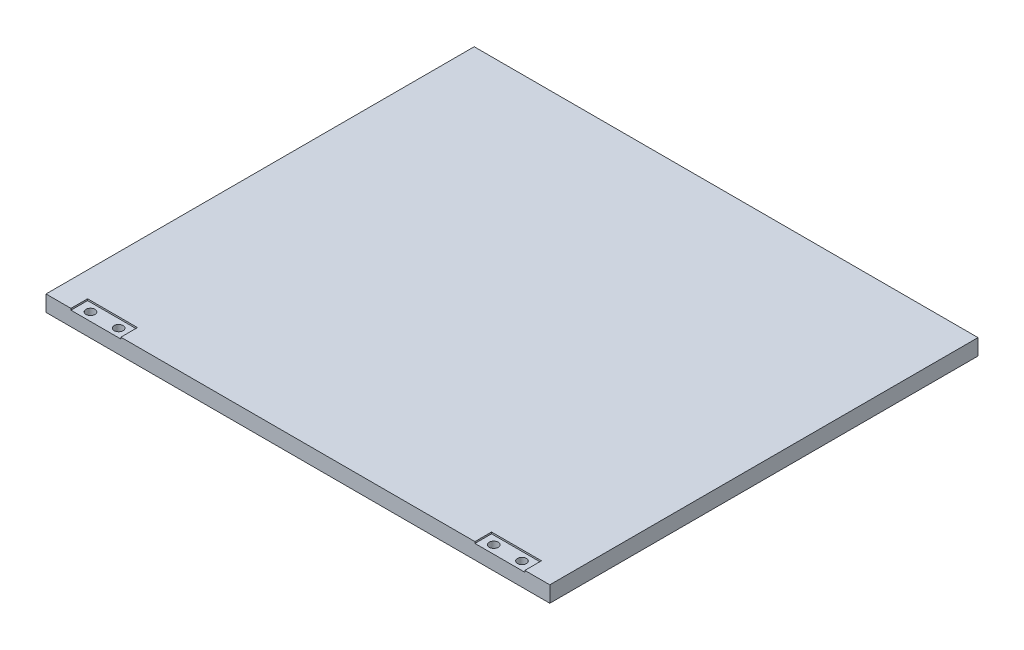
ISO-10303-21;
HEADER;
FILE_DESCRIPTION(('STEP AP214'),'2;1');
FILE_NAME('part.step','',(''),(''),'','','');
FILE_SCHEMA(('AUTOMOTIVE_DESIGN { 1 0 10303 214 1 1 1 1 }'));
ENDSEC;
DATA;
#1=APPLICATION_CONTEXT('core data for automotive mechanical design processes');
#2=APPLICATION_PROTOCOL_DEFINITION('international standard','automotive_design',2000,#1);
#3=PRODUCT_CONTEXT('',#1,'mechanical');
#4=PRODUCT('Part','Part','',(#3));
#5=PRODUCT_RELATED_PRODUCT_CATEGORY('part','',(#4));
#6=PRODUCT_DEFINITION_FORMATION('','',#4);
#7=PRODUCT_DEFINITION_CONTEXT('part definition',#1,'design');
#8=PRODUCT_DEFINITION('design','',#6,#7);
#9=PRODUCT_DEFINITION_SHAPE('','',#8);
#10=(LENGTH_UNIT() NAMED_UNIT(*) SI_UNIT(.MILLI.,.METRE.));
#11=(NAMED_UNIT(*) PLANE_ANGLE_UNIT() SI_UNIT($,.RADIAN.));
#12=(NAMED_UNIT(*) SI_UNIT($,.STERADIAN.) SOLID_ANGLE_UNIT());
#13=UNCERTAINTY_MEASURE_WITH_UNIT(LENGTH_MEASURE(1.E-05),#10,'distance_accuracy_value','');
#14=(GEOMETRIC_REPRESENTATION_CONTEXT(3) GLOBAL_UNCERTAINTY_ASSIGNED_CONTEXT((#13)) GLOBAL_UNIT_ASSIGNED_CONTEXT((#10,
#11,#12)) REPRESENTATION_CONTEXT('',''));
#15=CARTESIAN_POINT('',(0.,0.,0.));
#16=DIRECTION('',(0.,0.,1.));
#17=DIRECTION('',(1.,0.,0.));
#18=AXIS2_PLACEMENT_3D('',#15,#16,#17);
#19=CARTESIAN_POINT('',(0.,0.,0.));
#20=DIRECTION('',(0.,-1.,0.));
#21=DIRECTION('',(0.,0.,-1.));
#22=AXIS2_PLACEMENT_3D('',#19,#20,#21);
#23=PLANE('',#22);
#24=DIRECTION('',(1.,0.,0.));
#25=VECTOR('',#24,1.);
#26=CARTESIAN_POINT('',(71.948,0.,84.223));
#27=LINE('',#26,#25);
#28=CARTESIAN_POINT('',(71.948,0.,84.223));
#29=VERTEX_POINT('',#28);
#30=CARTESIAN_POINT('',(76.998,0.,84.223));
#31=VERTEX_POINT('',#30);
#32=EDGE_CURVE('E302',#29,#31,#27,.T.);
#33=ORIENTED_EDGE('',*,*,#32,.T.);
#34=DIRECTION('',(0.,0.,-1.));
#35=VECTOR('',#34,1.);
#36=CARTESIAN_POINT('',(76.998,0.,79.173));
#37=LINE('',#36,#35);
#38=CARTESIAN_POINT('',(76.998,0.,79.173));
#39=VERTEX_POINT('',#38);
#40=EDGE_CURVE('E68',#31,#39,#37,.T.);
#41=ORIENTED_EDGE('',*,*,#40,.T.);
#42=DIRECTION('',(-1.,0.,0.));
#43=VECTOR('',#42,1.);
#44=CARTESIAN_POINT('',(71.948,0.,79.173));
#45=LINE('',#44,#43);
#46=CARTESIAN_POINT('',(71.948,0.,79.173));
#47=VERTEX_POINT('',#46);
#48=EDGE_CURVE('E290',#39,#47,#45,.T.);
#49=ORIENTED_EDGE('',*,*,#48,.T.);
#50=DIRECTION('',(0.,0.,1.));
#51=VECTOR('',#50,1.);
#52=CARTESIAN_POINT('',(71.948,0.,79.173));
#53=LINE('',#52,#51);
#54=EDGE_CURVE('E306',#47,#29,#53,.T.);
#55=ORIENTED_EDGE('',*,*,#54,.T.);
#56=EDGE_LOOP('',(#33,#41,#49,#55));
#57=FACE_BOUND('',#56,.T.);
#58=DIRECTION('',(0.,0.,1.));
#59=VECTOR('',#58,1.);
#60=CARTESIAN_POINT('',(-83.124,0.,79.173));
#61=LINE('',#60,#59);
#62=CARTESIAN_POINT('',(-83.124,0.,79.173));
#63=VERTEX_POINT('',#62);
#64=CARTESIAN_POINT('',(-83.124,0.,84.223));
#65=VERTEX_POINT('',#64);
#66=EDGE_CURVE('E390',#63,#65,#61,.T.);
#67=ORIENTED_EDGE('',*,*,#66,.F.);
#68=DIRECTION('',(1.,0.,0.));
#69=VECTOR('',#68,1.);
#70=CARTESIAN_POINT('',(-88.174,0.,79.173));
#71=LINE('',#70,#69);
#72=CARTESIAN_POINT('',(-88.174,0.,79.173));
#73=VERTEX_POINT('',#72);
#74=EDGE_CURVE('E377',#73,#63,#71,.T.);
#75=ORIENTED_EDGE('',*,*,#74,.F.);
#76=DIRECTION('',(0.,0.,-1.));
#77=VECTOR('',#76,1.);
#78=CARTESIAN_POINT('',(-88.174,0.,79.173));
#79=LINE('',#78,#77);
#80=CARTESIAN_POINT('',(-88.174,0.,84.223));
#81=VERTEX_POINT('',#80);
#82=EDGE_CURVE('E398',#81,#73,#79,.T.);
#83=ORIENTED_EDGE('',*,*,#82,.F.);
#84=DIRECTION('',(-1.,0.,0.));
#85=VECTOR('',#84,1.);
#86=CARTESIAN_POINT('',(-88.174,0.,84.223));
#87=LINE('',#86,#85);
#88=EDGE_CURVE('E393',#65,#81,#87,.T.);
#89=ORIENTED_EDGE('',*,*,#88,.F.);
#90=EDGE_LOOP('',(#67,#75,#83,#89));
#91=FACE_BOUND('',#90,.T.);
#92=DIRECTION('',(0.,0.,-1.));
#93=VECTOR('',#92,1.);
#94=CARTESIAN_POINT('',(-76.998,0.,79.173));
#95=LINE('',#94,#93);
#96=CARTESIAN_POINT('',(-76.998,0.,84.223));
#97=VERTEX_POINT('',#96);
#98=CARTESIAN_POINT('',(-76.998,0.,79.173));
#99=VERTEX_POINT('',#98);
#100=EDGE_CURVE('E394',#97,#99,#95,.T.);
#101=ORIENTED_EDGE('',*,*,#100,.F.);
#102=DIRECTION('',(-1.,0.,0.));
#103=VECTOR('',#102,1.);
#104=CARTESIAN_POINT('',(-71.948,0.,84.223));
#105=LINE('',#104,#103);
#106=CARTESIAN_POINT('',(-71.948,0.,84.223));
#107=VERTEX_POINT('',#106);
#108=EDGE_CURVE('E431',#107,#97,#105,.T.);
#109=ORIENTED_EDGE('',*,*,#108,.F.);
#110=DIRECTION('',(0.,0.,1.));
#111=VECTOR('',#110,1.);
#112=CARTESIAN_POINT('',(-71.948,0.,79.173));
#113=LINE('',#112,#111);
#114=CARTESIAN_POINT('',(-71.948,0.,79.173));
#115=VERTEX_POINT('',#114);
#116=EDGE_CURVE('E435',#115,#107,#113,.T.);
#117=ORIENTED_EDGE('',*,*,#116,.F.);
#118=DIRECTION('',(1.,0.,0.));
#119=VECTOR('',#118,1.);
#120=CARTESIAN_POINT('',(-71.948,0.,79.173));
#121=LINE('',#120,#119);
#122=EDGE_CURVE('E440',#99,#115,#121,.T.);
#123=ORIENTED_EDGE('',*,*,#122,.F.);
#124=EDGE_LOOP('',(#101,#109,#117,#123));
#125=FACE_BOUND('',#124,.T.);
#126=DIRECTION('',(0.,0.,-1.));
#127=VECTOR('',#126,1.);
#128=CARTESIAN_POINT('',(100.,0.,85.));
#129=LINE('',#128,#127);
#130=CARTESIAN_POINT('',(100.,0.,85.));
#131=VERTEX_POINT('',#130);
#132=CARTESIAN_POINT('',(100.,0.,-85.));
#133=VERTEX_POINT('',#132);
#134=EDGE_CURVE('E500',#131,#133,#129,.T.);
#135=ORIENTED_EDGE('',*,*,#134,.F.);
#136=DIRECTION('',(1.,0.,0.));
#137=VECTOR('',#136,1.);
#138=CARTESIAN_POINT('',(-100.,0.,85.));
#139=LINE('',#138,#137);
#140=CARTESIAN_POINT('',(-100.,0.,85.));
#141=VERTEX_POINT('',#140);
#142=EDGE_CURVE('E515',#141,#131,#139,.T.);
#143=ORIENTED_EDGE('',*,*,#142,.F.);
#144=DIRECTION('',(0.,0.,1.));
#145=VECTOR('',#144,1.);
#146=CARTESIAN_POINT('',(-100.,0.,85.));
#147=LINE('',#146,#145);
#148=CARTESIAN_POINT('',(-100.,0.,-85.));
#149=VERTEX_POINT('',#148);
#150=EDGE_CURVE('E534',#149,#141,#147,.T.);
#151=ORIENTED_EDGE('',*,*,#150,.F.);
#152=DIRECTION('',(-1.,0.,0.));
#153=VECTOR('',#152,1.);
#154=CARTESIAN_POINT('',(-100.,0.,-85.));
#155=LINE('',#154,#153);
#156=EDGE_CURVE('E531',#133,#149,#155,.T.);
#157=ORIENTED_EDGE('',*,*,#156,.F.);
#158=EDGE_LOOP('',(#135,#143,#151,#157));
#159=FACE_BOUND('',#158,.T.);
#160=DIRECTION('',(-1.,0.,0.));
#161=VECTOR('',#160,1.);
#162=CARTESIAN_POINT('',(88.174,0.,79.173));
#163=LINE('',#162,#161);
#164=CARTESIAN_POINT('',(88.174,0.,79.173));
#165=VERTEX_POINT('',#164);
#166=CARTESIAN_POINT('',(83.124,0.,79.173));
#167=VERTEX_POINT('',#166);
#168=EDGE_CURVE('E269',#165,#167,#163,.T.);
#169=ORIENTED_EDGE('',*,*,#168,.T.);
#170=DIRECTION('',(0.,0.,1.));
#171=VECTOR('',#170,1.);
#172=CARTESIAN_POINT('',(83.124,0.,79.173));
#173=LINE('',#172,#171);
#174=CARTESIAN_POINT('',(83.124,0.,84.223));
#175=VERTEX_POINT('',#174);
#176=EDGE_CURVE('E60',#167,#175,#173,.T.);
#177=ORIENTED_EDGE('',*,*,#176,.T.);
#178=DIRECTION('',(1.,0.,0.));
#179=VECTOR('',#178,1.);
#180=CARTESIAN_POINT('',(88.174,0.,84.223));
#181=LINE('',#180,#179);
#182=CARTESIAN_POINT('',(88.174,0.,84.223));
#183=VERTEX_POINT('',#182);
#184=EDGE_CURVE('E256',#175,#183,#181,.T.);
#185=ORIENTED_EDGE('',*,*,#184,.T.);
#186=DIRECTION('',(0.,0.,-1.));
#187=VECTOR('',#186,1.);
#188=CARTESIAN_POINT('',(88.174,0.,79.173));
#189=LINE('',#188,#187);
#190=EDGE_CURVE('E260',#183,#165,#189,.T.);
#191=ORIENTED_EDGE('',*,*,#190,.T.);
#192=EDGE_LOOP('',(#169,#177,#185,#191));
#193=FACE_BOUND('',#192,.T.);
#194=ADVANCED_FACE('F42',(#57,#91,#125,#159,#193),#23,.T.);
#195=CARTESIAN_POINT('',(74.473,5.715,81.698));
#196=DIRECTION('',(0.,1.,0.));
#197=DIRECTION('',(0.,0.,1.));
#198=AXIS2_PLACEMENT_3D('',#195,#196,#197);
#199=CYLINDRICAL_SURFACE('',#198,1.77799999999999);
#200=CARTESIAN_POINT('',(74.473,5.715,81.698));
#201=DIRECTION('',(0.,1.,0.));
#202=DIRECTION('',(0.,0.,1.));
#203=AXIS2_PLACEMENT_3D('',#200,#201,#202);
#204=CIRCLE('',#203,1.77799999999999);
#205=CARTESIAN_POINT('',(74.473,5.715,83.476));
#206=VERTEX_POINT('',#205);
#207=EDGE_CURVE('E323',#206,#206,#204,.T.);
#208=ORIENTED_EDGE('',*,*,#207,.T.);
#209=EDGE_LOOP('',(#208));
#210=FACE_BOUND('',#209,.T.);
#211=CARTESIAN_POINT('',(74.473,2.,81.698));
#212=DIRECTION('',(0.,-1.,0.));
#213=DIRECTION('',(0.,0.,-1.));
#214=AXIS2_PLACEMENT_3D('',#211,#212,#213);
#215=CIRCLE('',#214,1.77799999999999);
#216=CARTESIAN_POINT('',(74.473,2.,79.92));
#217=VERTEX_POINT('',#216);
#218=EDGE_CURVE('E279',#217,#217,#215,.F.);
#219=ORIENTED_EDGE('',*,*,#218,.F.);
#220=EDGE_LOOP('',(#219));
#221=FACE_BOUND('',#220,.T.);
#222=ADVANCED_FACE('F578',(#210,#221),#199,.F.);
#223=CARTESIAN_POINT('',(-100.,6.35,85.));
#224=DIRECTION('',(0.,0.,-1.));
#225=DIRECTION('',(-1.,0.,0.));
#226=AXIS2_PLACEMENT_3D('',#223,#224,#225);
#227=PLANE('',#226);
#228=DIRECTION('',(0.,1.,0.));
#229=VECTOR('',#228,1.);
#230=CARTESIAN_POINT('',(90.094,5.715,85.));
#231=LINE('',#230,#229);
#232=CARTESIAN_POINT('',(90.094,5.715,85.));
#233=VERTEX_POINT('',#232);
#234=CARTESIAN_POINT('',(90.094,6.35,85.));
#235=VERTEX_POINT('',#234);
#236=EDGE_CURVE('E358',#233,#235,#231,.T.);
#237=ORIENTED_EDGE('',*,*,#236,.F.);
#238=DIRECTION('',(-1.,0.,0.));
#239=VECTOR('',#238,1.);
#240=CARTESIAN_POINT('',(90.094,5.715,85.));
#241=LINE('',#240,#239);
#242=CARTESIAN_POINT('',(70.282,5.715,85.));
#243=VERTEX_POINT('',#242);
#244=EDGE_CURVE('E343',#233,#243,#241,.T.);
#245=ORIENTED_EDGE('',*,*,#244,.T.);
#246=DIRECTION('',(0.,1.,0.));
#247=VECTOR('',#246,1.);
#248=CARTESIAN_POINT('',(70.282,5.715,85.));
#249=LINE('',#248,#247);
#250=CARTESIAN_POINT('',(70.282,6.35,85.));
#251=VERTEX_POINT('',#250);
#252=EDGE_CURVE('E362',#243,#251,#249,.T.);
#253=ORIENTED_EDGE('',*,*,#252,.T.);
#254=DIRECTION('',(1.,0.,0.));
#255=VECTOR('',#254,1.);
#256=CARTESIAN_POINT('',(-100.,6.35,85.));
#257=LINE('',#256,#255);
#258=CARTESIAN_POINT('',(-70.282,6.35,85.));
#259=VERTEX_POINT('',#258);
#260=EDGE_CURVE('E527',#259,#251,#257,.T.);
#261=ORIENTED_EDGE('',*,*,#260,.F.);
#262=DIRECTION('',(0.,1.,0.));
#263=VECTOR('',#262,1.);
#264=CARTESIAN_POINT('',(-70.282,5.715,85.));
#265=LINE('',#264,#263);
#266=CARTESIAN_POINT('',(-70.282,5.715,85.));
#267=VERTEX_POINT('',#266);
#268=EDGE_CURVE('E504',#267,#259,#265,.T.);
#269=ORIENTED_EDGE('',*,*,#268,.F.);
#270=DIRECTION('',(1.,0.,0.));
#271=VECTOR('',#270,1.);
#272=CARTESIAN_POINT('',(-90.094,5.715,85.));
#273=LINE('',#272,#271);
#274=CARTESIAN_POINT('',(-90.094,5.715,85.));
#275=VERTEX_POINT('',#274);
#276=EDGE_CURVE('E474',#275,#267,#273,.T.);
#277=ORIENTED_EDGE('',*,*,#276,.F.);
#278=DIRECTION('',(0.,1.,0.));
#279=VECTOR('',#278,1.);
#280=CARTESIAN_POINT('',(-90.094,5.715,85.));
#281=LINE('',#280,#279);
#282=CARTESIAN_POINT('',(-90.094,6.35,85.));
#283=VERTEX_POINT('',#282);
#284=EDGE_CURVE('E487',#275,#283,#281,.T.);
#285=ORIENTED_EDGE('',*,*,#284,.T.);
#286=CARTESIAN_POINT('',(-100.,6.35,85.));
#287=VERTEX_POINT('',#286);
#288=EDGE_CURVE('E522',#287,#283,#257,.T.);
#289=ORIENTED_EDGE('',*,*,#288,.F.);
#290=DIRECTION('',(0.,-1.,0.));
#291=VECTOR('',#290,1.);
#292=CARTESIAN_POINT('',(-100.,6.35,85.));
#293=LINE('',#292,#291);
#294=EDGE_CURVE('E542',#287,#141,#293,.T.);
#295=ORIENTED_EDGE('',*,*,#294,.T.);
#296=ORIENTED_EDGE('',*,*,#142,.T.);
#297=DIRECTION('',(0.,-1.,0.));
#298=VECTOR('',#297,1.);
#299=CARTESIAN_POINT('',(100.,6.35,85.));
#300=LINE('',#299,#298);
#301=CARTESIAN_POINT('',(100.,6.35,85.));
#302=VERTEX_POINT('',#301);
#303=EDGE_CURVE('E526',#302,#131,#300,.T.);
#304=ORIENTED_EDGE('',*,*,#303,.F.);
#305=EDGE_CURVE('E521',#235,#302,#257,.T.);
#306=ORIENTED_EDGE('',*,*,#305,.F.);
#307=EDGE_LOOP('',(#237,#245,#253,#261,#269,#277,#285,#289,#295,#296,#304,#306));
#308=FACE_BOUND('',#307,.T.);
#309=ADVANCED_FACE('F584',(#308),#227,.F.);
#310=CARTESIAN_POINT('',(0.,6.35,0.));
#311=DIRECTION('',(0.,-1.,0.));
#312=DIRECTION('',(0.,0.,-1.));
#313=AXIS2_PLACEMENT_3D('',#310,#311,#312);
#314=PLANE('',#313);
#315=DIRECTION('',(0.,0.,1.));
#316=VECTOR('',#315,1.);
#317=CARTESIAN_POINT('',(90.094,6.35,85.));
#318=LINE('',#317,#316);
#319=CARTESIAN_POINT('',(90.094,6.35,78.396));
#320=VERTEX_POINT('',#319);
#321=EDGE_CURVE('E331',#320,#235,#318,.T.);
#322=ORIENTED_EDGE('',*,*,#321,.T.);
#323=ORIENTED_EDGE('',*,*,#305,.T.);
#324=DIRECTION('',(0.,0.,-1.));
#325=VECTOR('',#324,1.);
#326=CARTESIAN_POINT('',(100.,6.35,85.));
#327=LINE('',#326,#325);
#328=CARTESIAN_POINT('',(100.,6.35,-85.));
#329=VERTEX_POINT('',#328);
#330=EDGE_CURVE('E510',#302,#329,#327,.T.);
#331=ORIENTED_EDGE('',*,*,#330,.T.);
#332=DIRECTION('',(-1.,0.,0.));
#333=VECTOR('',#332,1.);
#334=CARTESIAN_POINT('',(-100.,6.35,-85.));
#335=LINE('',#334,#333);
#336=CARTESIAN_POINT('',(-100.,6.35,-85.));
#337=VERTEX_POINT('',#336);
#338=EDGE_CURVE('E514',#329,#337,#335,.T.);
#339=ORIENTED_EDGE('',*,*,#338,.T.);
#340=DIRECTION('',(0.,0.,1.));
#341=VECTOR('',#340,1.);
#342=CARTESIAN_POINT('',(-100.,6.35,85.));
#343=LINE('',#342,#341);
#344=EDGE_CURVE('E518',#337,#287,#343,.T.);
#345=ORIENTED_EDGE('',*,*,#344,.T.);
#346=ORIENTED_EDGE('',*,*,#288,.T.);
#347=DIRECTION('',(0.,0.,1.));
#348=VECTOR('',#347,1.);
#349=CARTESIAN_POINT('',(-90.094,6.35,85.));
#350=LINE('',#349,#348);
#351=CARTESIAN_POINT('',(-90.094,6.35,78.396));
#352=VERTEX_POINT('',#351);
#353=EDGE_CURVE('E469',#352,#283,#350,.T.);
#354=ORIENTED_EDGE('',*,*,#353,.F.);
#355=DIRECTION('',(-1.,0.,0.));
#356=VECTOR('',#355,1.);
#357=CARTESIAN_POINT('',(-90.094,6.35,78.396));
#358=LINE('',#357,#356);
#359=CARTESIAN_POINT('',(-70.282,6.35,78.396));
#360=VERTEX_POINT('',#359);
#361=EDGE_CURVE('E475',#360,#352,#358,.T.);
#362=ORIENTED_EDGE('',*,*,#361,.F.);
#363=DIRECTION('',(0.,0.,-1.));
#364=VECTOR('',#363,1.);
#365=CARTESIAN_POINT('',(-70.282,6.35,85.));
#366=LINE('',#365,#364);
#367=EDGE_CURVE('E490',#259,#360,#366,.T.);
#368=ORIENTED_EDGE('',*,*,#367,.F.);
#369=ORIENTED_EDGE('',*,*,#260,.T.);
#370=DIRECTION('',(0.,0.,-1.));
#371=VECTOR('',#370,1.);
#372=CARTESIAN_POINT('',(70.282,6.35,85.));
#373=LINE('',#372,#371);
#374=CARTESIAN_POINT('',(70.282,6.35,78.396));
#375=VERTEX_POINT('',#374);
#376=EDGE_CURVE('E337',#251,#375,#373,.T.);
#377=ORIENTED_EDGE('',*,*,#376,.T.);
#378=DIRECTION('',(1.,0.,0.));
#379=VECTOR('',#378,1.);
#380=CARTESIAN_POINT('',(90.094,6.35,78.396));
#381=LINE('',#380,#379);
#382=EDGE_CURVE('E351',#375,#320,#381,.T.);
#383=ORIENTED_EDGE('',*,*,#382,.T.);
#384=EDGE_LOOP('',(#322,#323,#331,#339,#345,#346,#354,#362,#368,#369,#377,#383));
#385=FACE_BOUND('',#384,.T.);
#386=ADVANCED_FACE('F590',(#385),#314,.F.);
#387=CARTESIAN_POINT('',(-74.473,5.715,81.698));
#388=DIRECTION('',(0.,1.,0.));
#389=DIRECTION('',(0.,0.,1.));
#390=AXIS2_PLACEMENT_3D('',#387,#388,#389);
#391=CYLINDRICAL_SURFACE('',#390,1.77799999999999);
#392=CARTESIAN_POINT('',(-74.473,5.715,81.698));
#393=DIRECTION('',(0.,1.,0.));
#394=DIRECTION('',(0.,0.,1.));
#395=AXIS2_PLACEMENT_3D('',#392,#393,#394);
#396=CIRCLE('',#395,1.77799999999999);
#397=CARTESIAN_POINT('',(-74.473,5.715,83.476));
#398=VERTEX_POINT('',#397);
#399=EDGE_CURVE('E460',#398,#398,#396,.T.);
#400=ORIENTED_EDGE('',*,*,#399,.T.);
#401=EDGE_LOOP('',(#400));
#402=FACE_BOUND('',#401,.T.);
#403=CARTESIAN_POINT('',(-74.473,2.,81.698));
#404=DIRECTION('',(0.,-1.,0.));
#405=DIRECTION('',(0.,0.,-1.));
#406=AXIS2_PLACEMENT_3D('',#403,#404,#405);
#407=CIRCLE('',#406,1.77799999999999);
#408=CARTESIAN_POINT('',(-74.473,2.,79.92));
#409=VERTEX_POINT('',#408);
#410=EDGE_CURVE('E408',#409,#409,#407,.F.);
#411=ORIENTED_EDGE('',*,*,#410,.F.);
#412=EDGE_LOOP('',(#411));
#413=FACE_BOUND('',#412,.T.);
#414=ADVANCED_FACE('F605',(#402,#413),#391,.F.);
#415=CARTESIAN_POINT('',(100.,6.35,85.));
#416=DIRECTION('',(-1.,0.,0.));
#417=DIRECTION('',(0.,0.,1.));
#418=AXIS2_PLACEMENT_3D('',#415,#416,#417);
#419=PLANE('',#418);
#420=ORIENTED_EDGE('',*,*,#134,.T.);
#421=DIRECTION('',(0.,-1.,0.));
#422=VECTOR('',#421,1.);
#423=CARTESIAN_POINT('',(100.,6.35,-85.));
#424=LINE('',#423,#422);
#425=EDGE_CURVE('E11',#329,#133,#424,.T.);
#426=ORIENTED_EDGE('',*,*,#425,.F.);
#427=ORIENTED_EDGE('',*,*,#330,.F.);
#428=ORIENTED_EDGE('',*,*,#303,.T.);
#429=EDGE_LOOP('',(#420,#426,#427,#428));
#430=FACE_BOUND('',#429,.T.);
#431=ADVANCED_FACE('F44',(#430),#419,.F.);
#432=CARTESIAN_POINT('',(-100.,6.35,-85.));
#433=DIRECTION('',(0.,0.,1.));
#434=DIRECTION('',(1.,0.,0.));
#435=AXIS2_PLACEMENT_3D('',#432,#433,#434);
#436=PLANE('',#435);
#437=ORIENTED_EDGE('',*,*,#156,.T.);
#438=DIRECTION('',(0.,-1.,0.));
#439=VECTOR('',#438,1.);
#440=CARTESIAN_POINT('',(-100.,6.35,-85.));
#441=LINE('',#440,#439);
#442=EDGE_CURVE('E52',#337,#149,#441,.T.);
#443=ORIENTED_EDGE('',*,*,#442,.F.);
#444=ORIENTED_EDGE('',*,*,#338,.F.);
#445=ORIENTED_EDGE('',*,*,#425,.T.);
#446=EDGE_LOOP('',(#437,#443,#444,#445));
#447=FACE_BOUND('',#446,.T.);
#448=ADVANCED_FACE('F598',(#447),#436,.F.);
#449=CARTESIAN_POINT('',(-100.,6.35,85.));
#450=DIRECTION('',(1.,0.,0.));
#451=DIRECTION('',(0.,0.,-1.));
#452=AXIS2_PLACEMENT_3D('',#449,#450,#451);
#453=PLANE('',#452);
#454=ORIENTED_EDGE('',*,*,#150,.T.);
#455=ORIENTED_EDGE('',*,*,#294,.F.);
#456=ORIENTED_EDGE('',*,*,#344,.F.);
#457=ORIENTED_EDGE('',*,*,#442,.T.);
#458=EDGE_LOOP('',(#454,#455,#456,#457));
#459=FACE_BOUND('',#458,.T.);
#460=ADVANCED_FACE('F595',(#459),#453,.F.);
#461=CARTESIAN_POINT('',(-90.094,5.715,85.));
#462=DIRECTION('',(-1.,0.,0.));
#463=DIRECTION('',(0.,0.,1.));
#464=AXIS2_PLACEMENT_3D('',#461,#462,#463);
#465=PLANE('',#464);
#466=ORIENTED_EDGE('',*,*,#353,.T.);
#467=ORIENTED_EDGE('',*,*,#284,.F.);
#468=DIRECTION('',(0.,0.,1.));
#469=VECTOR('',#468,1.);
#470=CARTESIAN_POINT('',(-90.094,5.715,85.));
#471=LINE('',#470,#469);
#472=CARTESIAN_POINT('',(-90.094,5.715,78.396));
#473=VERTEX_POINT('',#472);
#474=EDGE_CURVE('E470',#473,#275,#471,.T.);
#475=ORIENTED_EDGE('',*,*,#474,.F.);
#476=DIRECTION('',(0.,1.,0.));
#477=VECTOR('',#476,1.);
#478=CARTESIAN_POINT('',(-90.094,5.715,78.396));
#479=LINE('',#478,#477);
#480=EDGE_CURVE('E497',#473,#352,#479,.T.);
#481=ORIENTED_EDGE('',*,*,#480,.T.);
#482=EDGE_LOOP('',(#466,#467,#475,#481));
#483=FACE_BOUND('',#482,.T.);
#484=ADVANCED_FACE('F597',(#483),#465,.F.);
#485=CARTESIAN_POINT('',(-90.094,5.715,78.396));
#486=DIRECTION('',(0.,0.,-1.));
#487=DIRECTION('',(-1.,0.,0.));
#488=AXIS2_PLACEMENT_3D('',#485,#486,#487);
#489=PLANE('',#488);
#490=ORIENTED_EDGE('',*,*,#361,.T.);
#491=ORIENTED_EDGE('',*,*,#480,.F.);
#492=DIRECTION('',(-1.,0.,0.));
#493=VECTOR('',#492,1.);
#494=CARTESIAN_POINT('',(-90.094,5.715,78.396));
#495=LINE('',#494,#493);
#496=CARTESIAN_POINT('',(-70.282,5.715,78.396));
#497=VERTEX_POINT('',#496);
#498=EDGE_CURVE('E483',#497,#473,#495,.T.);
#499=ORIENTED_EDGE('',*,*,#498,.F.);
#500=DIRECTION('',(0.,1.,0.));
#501=VECTOR('',#500,1.);
#502=CARTESIAN_POINT('',(-70.282,5.715,78.396));
#503=LINE('',#502,#501);
#504=EDGE_CURVE('E501',#497,#360,#503,.T.);
#505=ORIENTED_EDGE('',*,*,#504,.T.);
#506=EDGE_LOOP('',(#490,#491,#499,#505));
#507=FACE_BOUND('',#506,.T.);
#508=ADVANCED_FACE('F704',(#507),#489,.F.);
#509=CARTESIAN_POINT('',(-70.282,5.715,85.));
#510=DIRECTION('',(1.,0.,0.));
#511=DIRECTION('',(0.,0.,-1.));
#512=AXIS2_PLACEMENT_3D('',#509,#510,#511);
#513=PLANE('',#512);
#514=ORIENTED_EDGE('',*,*,#367,.T.);
#515=ORIENTED_EDGE('',*,*,#504,.F.);
#516=DIRECTION('',(0.,0.,-1.));
#517=VECTOR('',#516,1.);
#518=CARTESIAN_POINT('',(-70.282,5.715,85.));
#519=LINE('',#518,#517);
#520=EDGE_CURVE('E479',#267,#497,#519,.T.);
#521=ORIENTED_EDGE('',*,*,#520,.F.);
#522=ORIENTED_EDGE('',*,*,#268,.T.);
#523=EDGE_LOOP('',(#514,#515,#521,#522));
#524=FACE_BOUND('',#523,.T.);
#525=ADVANCED_FACE('F702',(#524),#513,.F.);
#526=CARTESIAN_POINT('',(0.,5.715,0.));
#527=DIRECTION('',(0.,-1.,0.));
#528=DIRECTION('',(0.,0.,-1.));
#529=AXIS2_PLACEMENT_3D('',#526,#527,#528);
#530=PLANE('',#529);
#531=ORIENTED_EDGE('',*,*,#399,.F.);
#532=EDGE_LOOP('',(#531));
#533=FACE_BOUND('',#532,.T.);
#534=CARTESIAN_POINT('',(-85.649,5.715,81.698));
#535=DIRECTION('',(0.,1.,0.));
#536=DIRECTION('',(0.,0.,1.));
#537=AXIS2_PLACEMENT_3D('',#534,#535,#536);
#538=CIRCLE('',#537,1.77799999999999);
#539=CARTESIAN_POINT('',(-85.649,5.715,83.476));
#540=VERTEX_POINT('',#539);
#541=EDGE_CURVE('E464',#540,#540,#538,.T.);
#542=ORIENTED_EDGE('',*,*,#541,.F.);
#543=EDGE_LOOP('',(#542));
#544=FACE_BOUND('',#543,.T.);
#545=ORIENTED_EDGE('',*,*,#474,.T.);
#546=ORIENTED_EDGE('',*,*,#276,.T.);
#547=ORIENTED_EDGE('',*,*,#520,.T.);
#548=ORIENTED_EDGE('',*,*,#498,.T.);
#549=EDGE_LOOP('',(#545,#546,#547,#548));
#550=FACE_BOUND('',#549,.T.);
#551=ADVANCED_FACE('F698',(#533,#544,#550),#530,.F.);
#552=CARTESIAN_POINT('',(-85.649,5.715,81.698));
#553=DIRECTION('',(0.,1.,0.));
#554=DIRECTION('',(0.,0.,1.));
#555=AXIS2_PLACEMENT_3D('',#552,#553,#554);
#556=CYLINDRICAL_SURFACE('',#555,1.77799999999999);
#557=CARTESIAN_POINT('',(-85.649,2.,81.698));
#558=DIRECTION('',(0.,1.,0.));
#559=DIRECTION('',(0.,0.,1.));
#560=AXIS2_PLACEMENT_3D('',#557,#558,#559);
#561=CIRCLE('',#560,1.77799999999999);
#562=CARTESIAN_POINT('',(-85.649,2.,83.476));
#563=VERTEX_POINT('',#562);
#564=EDGE_CURVE('E465',#563,#563,#561,.F.);
#565=ORIENTED_EDGE('',*,*,#564,.T.);
#566=EDGE_LOOP('',(#565));
#567=FACE_BOUND('',#566,.T.);
#568=ORIENTED_EDGE('',*,*,#541,.T.);
#569=EDGE_LOOP('',(#568));
#570=FACE_BOUND('',#569,.T.);
#571=ADVANCED_FACE('F691',(#567,#570),#556,.F.);
#572=CARTESIAN_POINT('',(0.,2.,0.));
#573=DIRECTION('',(0.,-1.,0.));
#574=DIRECTION('',(0.,0.,-1.));
#575=AXIS2_PLACEMENT_3D('',#572,#573,#574);
#576=PLANE('',#575);
#577=DIRECTION('',(0.,0.,-1.));
#578=VECTOR('',#577,1.);
#579=CARTESIAN_POINT('',(-76.998,2.,79.173));
#580=LINE('',#579,#578);
#581=CARTESIAN_POINT('',(-76.998,2.,84.223));
#582=VERTEX_POINT('',#581);
#583=CARTESIAN_POINT('',(-76.998,2.,79.173));
#584=VERTEX_POINT('',#583);
#585=EDGE_CURVE('E436',#582,#584,#580,.T.);
#586=ORIENTED_EDGE('',*,*,#585,.T.);
#587=DIRECTION('',(1.,0.,0.));
#588=VECTOR('',#587,1.);
#589=CARTESIAN_POINT('',(-71.948,2.,79.173));
#590=LINE('',#589,#588);
#591=CARTESIAN_POINT('',(-71.948,2.,79.173));
#592=VERTEX_POINT('',#591);
#593=EDGE_CURVE('E453',#584,#592,#590,.T.);
#594=ORIENTED_EDGE('',*,*,#593,.T.);
#595=DIRECTION('',(0.,0.,1.));
#596=VECTOR('',#595,1.);
#597=CARTESIAN_POINT('',(-71.948,2.,79.173));
#598=LINE('',#597,#596);
#599=CARTESIAN_POINT('',(-71.948,2.,84.223));
#600=VERTEX_POINT('',#599);
#601=EDGE_CURVE('E449',#592,#600,#598,.T.);
#602=ORIENTED_EDGE('',*,*,#601,.T.);
#603=DIRECTION('',(-1.,0.,0.));
#604=VECTOR('',#603,1.);
#605=CARTESIAN_POINT('',(-71.948,2.,84.223));
#606=LINE('',#605,#604);
#607=EDGE_CURVE('E422',#600,#582,#606,.T.);
#608=ORIENTED_EDGE('',*,*,#607,.T.);
#609=EDGE_LOOP('',(#586,#594,#602,#608));
#610=FACE_BOUND('',#609,.T.);
#611=ORIENTED_EDGE('',*,*,#410,.T.);
#612=EDGE_LOOP('',(#611));
#613=FACE_BOUND('',#612,.T.);
#614=ADVANCED_FACE('F677',(#610,#613),#576,.T.);
#615=CARTESIAN_POINT('',(-76.998,2.,79.173));
#616=DIRECTION('',(-1.,0.,0.));
#617=DIRECTION('',(0.,0.,1.));
#618=AXIS2_PLACEMENT_3D('',#615,#616,#617);
#619=PLANE('',#618);
#620=ORIENTED_EDGE('',*,*,#100,.T.);
#621=DIRECTION('',(0.,-1.,0.));
#622=VECTOR('',#621,1.);
#623=CARTESIAN_POINT('',(-76.998,2.,79.173));
#624=LINE('',#623,#622);
#625=EDGE_CURVE('E418',#584,#99,#624,.T.);
#626=ORIENTED_EDGE('',*,*,#625,.F.);
#627=ORIENTED_EDGE('',*,*,#585,.F.);
#628=DIRECTION('',(0.,-1.,0.));
#629=VECTOR('',#628,1.);
#630=CARTESIAN_POINT('',(-76.998,2.,84.223));
#631=LINE('',#630,#629);
#632=EDGE_CURVE('E361',#582,#97,#631,.T.);
#633=ORIENTED_EDGE('',*,*,#632,.T.);
#634=EDGE_LOOP('',(#620,#626,#627,#633));
#635=FACE_BOUND('',#634,.T.);
#636=ADVANCED_FACE('F673',(#635),#619,.F.);
#637=CARTESIAN_POINT('',(-71.948,2.,84.223));
#638=DIRECTION('',(0.,0.,1.));
#639=DIRECTION('',(1.,0.,0.));
#640=AXIS2_PLACEMENT_3D('',#637,#638,#639);
#641=PLANE('',#640);
#642=ORIENTED_EDGE('',*,*,#108,.T.);
#643=ORIENTED_EDGE('',*,*,#632,.F.);
#644=ORIENTED_EDGE('',*,*,#607,.F.);
#645=DIRECTION('',(0.,-1.,0.));
#646=VECTOR('',#645,1.);
#647=CARTESIAN_POINT('',(-71.948,2.,84.223));
#648=LINE('',#647,#646);
#649=EDGE_CURVE('E426',#600,#107,#648,.T.);
#650=ORIENTED_EDGE('',*,*,#649,.T.);
#651=EDGE_LOOP('',(#642,#643,#644,#650));
#652=FACE_BOUND('',#651,.T.);
#653=ADVANCED_FACE('F676',(#652),#641,.F.);
#654=CARTESIAN_POINT('',(-71.948,2.,79.173));
#655=DIRECTION('',(1.,0.,0.));
#656=DIRECTION('',(0.,0.,-1.));
#657=AXIS2_PLACEMENT_3D('',#654,#655,#656);
#658=PLANE('',#657);
#659=ORIENTED_EDGE('',*,*,#116,.T.);
#660=ORIENTED_EDGE('',*,*,#649,.F.);
#661=ORIENTED_EDGE('',*,*,#601,.F.);
#662=DIRECTION('',(0.,-1.,0.));
#663=VECTOR('',#662,1.);
#664=CARTESIAN_POINT('',(-71.948,2.,79.173));
#665=LINE('',#664,#663);
#666=EDGE_CURVE('E423',#592,#115,#665,.T.);
#667=ORIENTED_EDGE('',*,*,#666,.T.);
#668=EDGE_LOOP('',(#659,#660,#661,#667));
#669=FACE_BOUND('',#668,.T.);
#670=ADVANCED_FACE('F681',(#669),#658,.F.);
#671=CARTESIAN_POINT('',(-71.948,2.,79.173));
#672=DIRECTION('',(0.,0.,-1.));
#673=DIRECTION('',(-1.,0.,0.));
#674=AXIS2_PLACEMENT_3D('',#671,#672,#673);
#675=PLANE('',#674);
#676=ORIENTED_EDGE('',*,*,#122,.T.);
#677=ORIENTED_EDGE('',*,*,#666,.F.);
#678=ORIENTED_EDGE('',*,*,#593,.F.);
#679=ORIENTED_EDGE('',*,*,#625,.T.);
#680=EDGE_LOOP('',(#676,#677,#678,#679));
#681=FACE_BOUND('',#680,.T.);
#682=ADVANCED_FACE('F661',(#681),#675,.F.);
#683=CARTESIAN_POINT('',(0.,2.,0.));
#684=DIRECTION('',(0.,1.,0.));
#685=DIRECTION('',(0.,0.,1.));
#686=AXIS2_PLACEMENT_3D('',#683,#684,#685);
#687=PLANE('',#686);
#688=DIRECTION('',(0.,0.,1.));
#689=VECTOR('',#688,1.);
#690=CARTESIAN_POINT('',(-83.124,2.,79.173));
#691=LINE('',#690,#689);
#692=CARTESIAN_POINT('',(-83.124,2.,79.173));
#693=VERTEX_POINT('',#692);
#694=CARTESIAN_POINT('',(-83.124,2.,84.223));
#695=VERTEX_POINT('',#694);
#696=EDGE_CURVE('E372',#693,#695,#691,.T.);
#697=ORIENTED_EDGE('',*,*,#696,.T.);
#698=DIRECTION('',(-1.,0.,0.));
#699=VECTOR('',#698,1.);
#700=CARTESIAN_POINT('',(-88.174,2.,84.223));
#701=LINE('',#700,#699);
#702=CARTESIAN_POINT('',(-88.174,2.,84.223));
#703=VERTEX_POINT('',#702);
#704=EDGE_CURVE('E376',#695,#703,#701,.T.);
#705=ORIENTED_EDGE('',*,*,#704,.T.);
#706=DIRECTION('',(0.,0.,-1.));
#707=VECTOR('',#706,1.);
#708=CARTESIAN_POINT('',(-88.174,2.,79.173));
#709=LINE('',#708,#707);
#710=CARTESIAN_POINT('',(-88.174,2.,79.173));
#711=VERTEX_POINT('',#710);
#712=EDGE_CURVE('E381',#703,#711,#709,.T.);
#713=ORIENTED_EDGE('',*,*,#712,.T.);
#714=DIRECTION('',(1.,0.,0.));
#715=VECTOR('',#714,1.);
#716=CARTESIAN_POINT('',(-88.174,2.,79.173));
#717=LINE('',#716,#715);
#718=EDGE_CURVE('E385',#711,#693,#717,.T.);
#719=ORIENTED_EDGE('',*,*,#718,.T.);
#720=EDGE_LOOP('',(#697,#705,#713,#719));
#721=FACE_BOUND('',#720,.T.);
#722=ORIENTED_EDGE('',*,*,#564,.F.);
#723=EDGE_LOOP('',(#722));
#724=FACE_BOUND('',#723,.T.);
#725=ADVANCED_FACE('F657',(#721,#724),#687,.F.);
#726=CARTESIAN_POINT('',(-83.124,2.,79.173));
#727=DIRECTION('',(1.,0.,0.));
#728=DIRECTION('',(0.,0.,-1.));
#729=AXIS2_PLACEMENT_3D('',#726,#727,#728);
#730=PLANE('',#729);
#731=ORIENTED_EDGE('',*,*,#66,.T.);
#732=DIRECTION('',(0.,-1.,0.));
#733=VECTOR('',#732,1.);
#734=CARTESIAN_POINT('',(-83.124,2.,84.223));
#735=LINE('',#734,#733);
#736=EDGE_CURVE('E389',#695,#65,#735,.T.);
#737=ORIENTED_EDGE('',*,*,#736,.F.);
#738=ORIENTED_EDGE('',*,*,#696,.F.);
#739=DIRECTION('',(0.,-1.,0.));
#740=VECTOR('',#739,1.);
#741=CARTESIAN_POINT('',(-83.124,2.,79.173));
#742=LINE('',#741,#740);
#743=EDGE_CURVE('E405',#693,#63,#742,.T.);
#744=ORIENTED_EDGE('',*,*,#743,.T.);
#745=EDGE_LOOP('',(#731,#737,#738,#744));
#746=FACE_BOUND('',#745,.T.);
#747=ADVANCED_FACE('F660',(#746),#730,.F.);
#748=CARTESIAN_POINT('',(-88.174,2.,79.173));
#749=DIRECTION('',(0.,0.,-1.));
#750=DIRECTION('',(-1.,0.,0.));
#751=AXIS2_PLACEMENT_3D('',#748,#749,#750);
#752=PLANE('',#751);
#753=ORIENTED_EDGE('',*,*,#74,.T.);
#754=ORIENTED_EDGE('',*,*,#743,.F.);
#755=ORIENTED_EDGE('',*,*,#718,.F.);
#756=DIRECTION('',(0.,-1.,0.));
#757=VECTOR('',#756,1.);
#758=CARTESIAN_POINT('',(-88.174,2.,79.173));
#759=LINE('',#758,#757);
#760=EDGE_CURVE('E409',#711,#73,#759,.T.);
#761=ORIENTED_EDGE('',*,*,#760,.T.);
#762=EDGE_LOOP('',(#753,#754,#755,#761));
#763=FACE_BOUND('',#762,.T.);
#764=ADVANCED_FACE('F663',(#763),#752,.F.);
#765=CARTESIAN_POINT('',(-88.174,2.,79.173));
#766=DIRECTION('',(-1.,0.,0.));
#767=DIRECTION('',(0.,0.,1.));
#768=AXIS2_PLACEMENT_3D('',#765,#766,#767);
#769=PLANE('',#768);
#770=ORIENTED_EDGE('',*,*,#82,.T.);
#771=ORIENTED_EDGE('',*,*,#760,.F.);
#772=ORIENTED_EDGE('',*,*,#712,.F.);
#773=DIRECTION('',(0.,-1.,0.));
#774=VECTOR('',#773,1.);
#775=CARTESIAN_POINT('',(-88.174,2.,84.223));
#776=LINE('',#775,#774);
#777=EDGE_CURVE('E412',#703,#81,#776,.T.);
#778=ORIENTED_EDGE('',*,*,#777,.T.);
#779=EDGE_LOOP('',(#770,#771,#772,#778));
#780=FACE_BOUND('',#779,.T.);
#781=ADVANCED_FACE('F652',(#780),#769,.F.);
#782=CARTESIAN_POINT('',(-88.174,2.,84.223));
#783=DIRECTION('',(0.,0.,1.));
#784=DIRECTION('',(1.,0.,0.));
#785=AXIS2_PLACEMENT_3D('',#782,#783,#784);
#786=PLANE('',#785);
#787=ORIENTED_EDGE('',*,*,#88,.T.);
#788=ORIENTED_EDGE('',*,*,#777,.F.);
#789=ORIENTED_EDGE('',*,*,#704,.F.);
#790=ORIENTED_EDGE('',*,*,#736,.T.);
#791=EDGE_LOOP('',(#787,#788,#789,#790));
#792=FACE_BOUND('',#791,.T.);
#793=ADVANCED_FACE('F645',(#792),#786,.F.);
#794=CARTESIAN_POINT('',(90.094,5.715,85.));
#795=DIRECTION('',(-1.,0.,0.));
#796=DIRECTION('',(0.,0.,1.));
#797=AXIS2_PLACEMENT_3D('',#794,#795,#796);
#798=PLANE('',#797);
#799=ORIENTED_EDGE('',*,*,#321,.F.);
#800=DIRECTION('',(0.,1.,0.));
#801=VECTOR('',#800,1.);
#802=CARTESIAN_POINT('',(90.094,5.715,78.396));
#803=LINE('',#802,#801);
#804=CARTESIAN_POINT('',(90.094,5.715,78.396));
#805=VERTEX_POINT('',#804);
#806=EDGE_CURVE('E347',#805,#320,#803,.T.);
#807=ORIENTED_EDGE('',*,*,#806,.F.);
#808=DIRECTION('',(0.,0.,1.));
#809=VECTOR('',#808,1.);
#810=CARTESIAN_POINT('',(90.094,5.715,85.));
#811=LINE('',#810,#809);
#812=EDGE_CURVE('E332',#805,#233,#811,.T.);
#813=ORIENTED_EDGE('',*,*,#812,.T.);
#814=ORIENTED_EDGE('',*,*,#236,.T.);
#815=EDGE_LOOP('',(#799,#807,#813,#814));
#816=FACE_BOUND('',#815,.T.);
#817=ADVANCED_FACE('F643',(#816),#798,.T.);
#818=CARTESIAN_POINT('',(70.282,5.715,85.));
#819=DIRECTION('',(1.,0.,0.));
#820=DIRECTION('',(0.,0.,-1.));
#821=AXIS2_PLACEMENT_3D('',#818,#819,#820);
#822=PLANE('',#821);
#823=ORIENTED_EDGE('',*,*,#376,.F.);
#824=ORIENTED_EDGE('',*,*,#252,.F.);
#825=DIRECTION('',(0.,0.,-1.));
#826=VECTOR('',#825,1.);
#827=CARTESIAN_POINT('',(70.282,5.715,85.));
#828=LINE('',#827,#826);
#829=CARTESIAN_POINT('',(70.282,5.715,78.396));
#830=VERTEX_POINT('',#829);
#831=EDGE_CURVE('E340',#243,#830,#828,.T.);
#832=ORIENTED_EDGE('',*,*,#831,.T.);
#833=DIRECTION('',(0.,1.,0.));
#834=VECTOR('',#833,1.);
#835=CARTESIAN_POINT('',(70.282,5.715,78.396));
#836=LINE('',#835,#834);
#837=EDGE_CURVE('E366',#830,#375,#836,.T.);
#838=ORIENTED_EDGE('',*,*,#837,.T.);
#839=EDGE_LOOP('',(#823,#824,#832,#838));
#840=FACE_BOUND('',#839,.T.);
#841=ADVANCED_FACE('F632',(#840),#822,.T.);
#842=CARTESIAN_POINT('',(90.094,5.715,78.396));
#843=DIRECTION('',(0.,0.,1.));
#844=DIRECTION('',(1.,0.,0.));
#845=AXIS2_PLACEMENT_3D('',#842,#843,#844);
#846=PLANE('',#845);
#847=ORIENTED_EDGE('',*,*,#382,.F.);
#848=ORIENTED_EDGE('',*,*,#837,.F.);
#849=DIRECTION('',(1.,0.,0.));
#850=VECTOR('',#849,1.);
#851=CARTESIAN_POINT('',(90.094,5.715,78.396));
#852=LINE('',#851,#850);
#853=EDGE_CURVE('E336',#830,#805,#852,.T.);
#854=ORIENTED_EDGE('',*,*,#853,.T.);
#855=ORIENTED_EDGE('',*,*,#806,.T.);
#856=EDGE_LOOP('',(#847,#848,#854,#855));
#857=FACE_BOUND('',#856,.T.);
#858=ADVANCED_FACE('F641',(#857),#846,.T.);
#859=CARTESIAN_POINT('',(0.,5.715,0.));
#860=DIRECTION('',(0.,-1.,0.));
#861=DIRECTION('',(0.,0.,-1.));
#862=AXIS2_PLACEMENT_3D('',#859,#860,#861);
#863=PLANE('',#862);
#864=ORIENTED_EDGE('',*,*,#207,.F.);
#865=EDGE_LOOP('',(#864));
#866=FACE_BOUND('',#865,.T.);
#867=CARTESIAN_POINT('',(85.649,5.715,81.698));
#868=DIRECTION('',(0.,1.,0.));
#869=DIRECTION('',(0.,0.,1.));
#870=AXIS2_PLACEMENT_3D('',#867,#868,#869);
#871=CIRCLE('',#870,1.77799999999999);
#872=CARTESIAN_POINT('',(85.649,5.715,83.476));
#873=VERTEX_POINT('',#872);
#874=EDGE_CURVE('E327',#873,#873,#871,.T.);
#875=ORIENTED_EDGE('',*,*,#874,.F.);
#876=EDGE_LOOP('',(#875));
#877=FACE_BOUND('',#876,.T.);
#878=ORIENTED_EDGE('',*,*,#812,.F.);
#879=ORIENTED_EDGE('',*,*,#853,.F.);
#880=ORIENTED_EDGE('',*,*,#831,.F.);
#881=ORIENTED_EDGE('',*,*,#244,.F.);
#882=EDGE_LOOP('',(#878,#879,#880,#881));
#883=FACE_BOUND('',#882,.T.);
#884=ADVANCED_FACE('F637',(#866,#877,#883),#863,.F.);
#885=CARTESIAN_POINT('',(85.649,5.715,81.698));
#886=DIRECTION('',(0.,1.,0.));
#887=DIRECTION('',(0.,0.,1.));
#888=AXIS2_PLACEMENT_3D('',#885,#886,#887);
#889=CYLINDRICAL_SURFACE('',#888,1.77799999999999);
#890=CARTESIAN_POINT('',(85.649,2.,81.698));
#891=DIRECTION('',(0.,1.,0.));
#892=DIRECTION('',(0.,0.,1.));
#893=AXIS2_PLACEMENT_3D('',#890,#891,#892);
#894=CIRCLE('',#893,1.77799999999999);
#895=CARTESIAN_POINT('',(85.649,2.,83.476));
#896=VERTEX_POINT('',#895);
#897=EDGE_CURVE('E46',#896,#896,#894,.F.);
#898=ORIENTED_EDGE('',*,*,#897,.T.);
#899=EDGE_LOOP('',(#898));
#900=FACE_BOUND('',#899,.T.);
#901=ORIENTED_EDGE('',*,*,#874,.T.);
#902=EDGE_LOOP('',(#901));
#903=FACE_BOUND('',#902,.T.);
#904=ADVANCED_FACE('F562',(#900,#903),#889,.F.);
#905=CARTESIAN_POINT('',(0.,2.,0.));
#906=DIRECTION('',(0.,-1.,0.));
#907=DIRECTION('',(0.,0.,-1.));
#908=AXIS2_PLACEMENT_3D('',#905,#906,#907);
#909=PLANE('',#908);
#910=DIRECTION('',(0.,0.,-1.));
#911=VECTOR('',#910,1.);
#912=CARTESIAN_POINT('',(76.998,2.,79.173));
#913=LINE('',#912,#911);
#914=CARTESIAN_POINT('',(76.998,2.,84.223));
#915=VERTEX_POINT('',#914);
#916=CARTESIAN_POINT('',(76.998,2.,79.173));
#917=VERTEX_POINT('',#916);
#918=EDGE_CURVE('E285',#915,#917,#913,.T.);
#919=ORIENTED_EDGE('',*,*,#918,.F.);
#920=DIRECTION('',(1.,0.,0.));
#921=VECTOR('',#920,1.);
#922=CARTESIAN_POINT('',(71.948,2.,84.223));
#923=LINE('',#922,#921);
#924=CARTESIAN_POINT('',(71.948,2.,84.223));
#925=VERTEX_POINT('',#924);
#926=EDGE_CURVE('E289',#925,#915,#923,.T.);
#927=ORIENTED_EDGE('',*,*,#926,.F.);
#928=DIRECTION('',(0.,0.,1.));
#929=VECTOR('',#928,1.);
#930=CARTESIAN_POINT('',(71.948,2.,79.173));
#931=LINE('',#930,#929);
#932=CARTESIAN_POINT('',(71.948,2.,79.173));
#933=VERTEX_POINT('',#932);
#934=EDGE_CURVE('E293',#933,#925,#931,.T.);
#935=ORIENTED_EDGE('',*,*,#934,.F.);
#936=DIRECTION('',(-1.,0.,0.));
#937=VECTOR('',#936,1.);
#938=CARTESIAN_POINT('',(71.948,2.,79.173));
#939=LINE('',#938,#937);
#940=EDGE_CURVE('E296',#917,#933,#939,.T.);
#941=ORIENTED_EDGE('',*,*,#940,.F.);
#942=EDGE_LOOP('',(#919,#927,#935,#941));
#943=FACE_BOUND('',#942,.T.);
#944=ORIENTED_EDGE('',*,*,#218,.T.);
#945=EDGE_LOOP('',(#944));
#946=FACE_BOUND('',#945,.T.);
#947=ADVANCED_FACE('F843',(#943,#946),#909,.T.);
#948=CARTESIAN_POINT('',(76.998,2.,79.173));
#949=DIRECTION('',(-1.,0.,0.));
#950=DIRECTION('',(0.,0.,1.));
#951=AXIS2_PLACEMENT_3D('',#948,#949,#950);
#952=PLANE('',#951);
#953=ORIENTED_EDGE('',*,*,#40,.F.);
#954=DIRECTION('',(0.,-1.,0.));
#955=VECTOR('',#954,1.);
#956=CARTESIAN_POINT('',(76.998,2.,84.223));
#957=LINE('',#956,#955);
#958=EDGE_CURVE('E299',#915,#31,#957,.T.);
#959=ORIENTED_EDGE('',*,*,#958,.F.);
#960=ORIENTED_EDGE('',*,*,#918,.T.);
#961=DIRECTION('',(0.,-1.,0.));
#962=VECTOR('',#961,1.);
#963=CARTESIAN_POINT('',(76.998,2.,79.173));
#964=LINE('',#963,#962);
#965=EDGE_CURVE('E270',#917,#39,#964,.T.);
#966=ORIENTED_EDGE('',*,*,#965,.T.);
#967=EDGE_LOOP('',(#953,#959,#960,#966));
#968=FACE_BOUND('',#967,.T.);
#969=ADVANCED_FACE('F851',(#968),#952,.T.);
#970=CARTESIAN_POINT('',(71.948,2.,79.173));
#971=DIRECTION('',(0.,0.,1.));
#972=DIRECTION('',(1.,0.,0.));
#973=AXIS2_PLACEMENT_3D('',#970,#971,#972);
#974=PLANE('',#973);
#975=ORIENTED_EDGE('',*,*,#48,.F.);
#976=ORIENTED_EDGE('',*,*,#965,.F.);
#977=ORIENTED_EDGE('',*,*,#940,.T.);
#978=DIRECTION('',(0.,-1.,0.));
#979=VECTOR('',#978,1.);
#980=CARTESIAN_POINT('',(71.948,2.,79.173));
#981=LINE('',#980,#979);
#982=EDGE_CURVE('E315',#933,#47,#981,.T.);
#983=ORIENTED_EDGE('',*,*,#982,.T.);
#984=EDGE_LOOP('',(#975,#976,#977,#983));
#985=FACE_BOUND('',#984,.T.);
#986=ADVANCED_FACE('F862',(#985),#974,.T.);
#987=CARTESIAN_POINT('',(71.948,2.,79.173));
#988=DIRECTION('',(1.,0.,0.));
#989=DIRECTION('',(0.,0.,-1.));
#990=AXIS2_PLACEMENT_3D('',#987,#988,#989);
#991=PLANE('',#990);
#992=ORIENTED_EDGE('',*,*,#54,.F.);
#993=ORIENTED_EDGE('',*,*,#982,.F.);
#994=ORIENTED_EDGE('',*,*,#934,.T.);
#995=DIRECTION('',(0.,-1.,0.));
#996=VECTOR('',#995,1.);
#997=CARTESIAN_POINT('',(71.948,2.,84.223));
#998=LINE('',#997,#996);
#999=EDGE_CURVE('E318',#925,#29,#998,.T.);
#1000=ORIENTED_EDGE('',*,*,#999,.T.);
#1001=EDGE_LOOP('',(#992,#993,#994,#1000));
#1002=FACE_BOUND('',#1001,.T.);
#1003=ADVANCED_FACE('F573',(#1002),#991,.T.);
#1004=CARTESIAN_POINT('',(71.948,2.,84.223));
#1005=DIRECTION('',(0.,0.,-1.));
#1006=DIRECTION('',(-1.,0.,0.));
#1007=AXIS2_PLACEMENT_3D('',#1004,#1005,#1006);
#1008=PLANE('',#1007);
#1009=ORIENTED_EDGE('',*,*,#32,.F.);
#1010=ORIENTED_EDGE('',*,*,#999,.F.);
#1011=ORIENTED_EDGE('',*,*,#926,.T.);
#1012=ORIENTED_EDGE('',*,*,#958,.T.);
#1013=EDGE_LOOP('',(#1009,#1010,#1011,#1012));
#1014=FACE_BOUND('',#1013,.T.);
#1015=ADVANCED_FACE('F565',(#1014),#1008,.T.);
#1016=CARTESIAN_POINT('',(0.,2.,0.));
#1017=DIRECTION('',(0.,1.,0.));
#1018=DIRECTION('',(0.,0.,1.));
#1019=AXIS2_PLACEMENT_3D('',#1016,#1017,#1018);
#1020=PLANE('',#1019);
#1021=DIRECTION('',(0.,0.,1.));
#1022=VECTOR('',#1021,1.);
#1023=CARTESIAN_POINT('',(83.124,2.,79.173));
#1024=LINE('',#1023,#1022);
#1025=CARTESIAN_POINT('',(83.124,2.,79.173));
#1026=VERTEX_POINT('',#1025);
#1027=CARTESIAN_POINT('',(83.124,2.,84.223));
#1028=VERTEX_POINT('',#1027);
#1029=EDGE_CURVE('E245',#1026,#1028,#1024,.T.);
#1030=ORIENTED_EDGE('',*,*,#1029,.F.);
#1031=DIRECTION('',(-1.,0.,0.));
#1032=VECTOR('',#1031,1.);
#1033=CARTESIAN_POINT('',(88.174,2.,79.173));
#1034=LINE('',#1033,#1032);
#1035=CARTESIAN_POINT('',(88.174,2.,79.173));
#1036=VERTEX_POINT('',#1035);
#1037=EDGE_CURVE('E234',#1036,#1026,#1034,.T.);
#1038=ORIENTED_EDGE('',*,*,#1037,.F.);
#1039=DIRECTION('',(0.,0.,-1.));
#1040=VECTOR('',#1039,1.);
#1041=CARTESIAN_POINT('',(88.174,2.,79.173));
#1042=LINE('',#1041,#1040);
#1043=CARTESIAN_POINT('',(88.174,2.,84.223));
#1044=VERTEX_POINT('',#1043);
#1045=EDGE_CURVE('E244',#1044,#1036,#1042,.T.);
#1046=ORIENTED_EDGE('',*,*,#1045,.F.);
#1047=DIRECTION('',(1.,0.,0.));
#1048=VECTOR('',#1047,1.);
#1049=CARTESIAN_POINT('',(88.174,2.,84.223));
#1050=LINE('',#1049,#1048);
#1051=EDGE_CURVE('E251',#1028,#1044,#1050,.T.);
#1052=ORIENTED_EDGE('',*,*,#1051,.F.);
#1053=EDGE_LOOP('',(#1030,#1038,#1046,#1052));
#1054=FACE_BOUND('',#1053,.T.);
#1055=ORIENTED_EDGE('',*,*,#897,.F.);
#1056=EDGE_LOOP('',(#1055));
#1057=FACE_BOUND('',#1056,.T.);
#1058=ADVANCED_FACE('F253',(#1054,#1057),#1020,.F.);
#1059=CARTESIAN_POINT('',(83.124,2.,79.173));
#1060=DIRECTION('',(1.,0.,0.));
#1061=DIRECTION('',(0.,0.,-1.));
#1062=AXIS2_PLACEMENT_3D('',#1059,#1060,#1061);
#1063=PLANE('',#1062);
#1064=ORIENTED_EDGE('',*,*,#176,.F.);
#1065=DIRECTION('',(0.,-1.,0.));
#1066=VECTOR('',#1065,1.);
#1067=CARTESIAN_POINT('',(83.124,2.,79.173));
#1068=LINE('',#1067,#1066);
#1069=EDGE_CURVE('E237',#1026,#167,#1068,.T.);
#1070=ORIENTED_EDGE('',*,*,#1069,.F.);
#1071=ORIENTED_EDGE('',*,*,#1029,.T.);
#1072=DIRECTION('',(0.,-1.,0.));
#1073=VECTOR('',#1072,1.);
#1074=CARTESIAN_POINT('',(83.124,2.,84.223));
#1075=LINE('',#1074,#1073);
#1076=EDGE_CURVE('E276',#1028,#175,#1075,.T.);
#1077=ORIENTED_EDGE('',*,*,#1076,.T.);
#1078=EDGE_LOOP('',(#1064,#1070,#1071,#1077));
#1079=FACE_BOUND('',#1078,.T.);
#1080=ADVANCED_FACE('F248',(#1079),#1063,.T.);
#1081=CARTESIAN_POINT('',(88.174,2.,84.223));
#1082=DIRECTION('',(0.,0.,-1.));
#1083=DIRECTION('',(-1.,0.,0.));
#1084=AXIS2_PLACEMENT_3D('',#1081,#1082,#1083);
#1085=PLANE('',#1084);
#1086=ORIENTED_EDGE('',*,*,#184,.F.);
#1087=ORIENTED_EDGE('',*,*,#1076,.F.);
#1088=ORIENTED_EDGE('',*,*,#1051,.T.);
#1089=DIRECTION('',(0.,-1.,0.));
#1090=VECTOR('',#1089,1.);
#1091=CARTESIAN_POINT('',(88.174,2.,84.223));
#1092=LINE('',#1091,#1090);
#1093=EDGE_CURVE('E280',#1044,#183,#1092,.T.);
#1094=ORIENTED_EDGE('',*,*,#1093,.T.);
#1095=EDGE_LOOP('',(#1086,#1087,#1088,#1094));
#1096=FACE_BOUND('',#1095,.T.);
#1097=ADVANCED_FACE('F571',(#1096),#1085,.T.);
#1098=CARTESIAN_POINT('',(88.174,2.,79.173));
#1099=DIRECTION('',(-1.,0.,0.));
#1100=DIRECTION('',(0.,0.,1.));
#1101=AXIS2_PLACEMENT_3D('',#1098,#1099,#1100);
#1102=PLANE('',#1101);
#1103=ORIENTED_EDGE('',*,*,#190,.F.);
#1104=ORIENTED_EDGE('',*,*,#1093,.F.);
#1105=ORIENTED_EDGE('',*,*,#1045,.T.);
#1106=DIRECTION('',(0.,-1.,0.));
#1107=VECTOR('',#1106,1.);
#1108=CARTESIAN_POINT('',(88.174,2.,79.173));
#1109=LINE('',#1108,#1107);
#1110=EDGE_CURVE('E239',#1036,#165,#1109,.T.);
#1111=ORIENTED_EDGE('',*,*,#1110,.T.);
#1112=EDGE_LOOP('',(#1103,#1104,#1105,#1111));
#1113=FACE_BOUND('',#1112,.T.);
#1114=ADVANCED_FACE('F911',(#1113),#1102,.T.);
#1115=CARTESIAN_POINT('',(88.174,2.,79.173));
#1116=DIRECTION('',(0.,0.,1.));
#1117=DIRECTION('',(1.,0.,0.));
#1118=AXIS2_PLACEMENT_3D('',#1115,#1116,#1117);
#1119=PLANE('',#1118);
#1120=ORIENTED_EDGE('',*,*,#168,.F.);
#1121=ORIENTED_EDGE('',*,*,#1110,.F.);
#1122=ORIENTED_EDGE('',*,*,#1037,.T.);
#1123=ORIENTED_EDGE('',*,*,#1069,.T.);
#1124=EDGE_LOOP('',(#1120,#1121,#1122,#1123));
#1125=FACE_BOUND('',#1124,.T.);
#1126=ADVANCED_FACE('F236',(#1125),#1119,.T.);
#1127=CLOSED_SHELL('',(#194,#222,#309,#386,#414,#431,#448,#460,#484,#508,#525,#551,#571,#614,
#636,#653,#670,#682,#725,#747,#764,#781,#793,#817,#841,#858,#884,#904,#947,#969,#986,#1003,
#1015,#1058,#1080,#1097,#1114,#1126));
#1128=MANIFOLD_SOLID_BREP('B2',#1127);
#1129=ADVANCED_BREP_SHAPE_REPRESENTATION('',(#18,#1128),#14);
#1130=SHAPE_DEFINITION_REPRESENTATION(#9,#1129);
ENDSEC;
END-ISO-10303-21;
